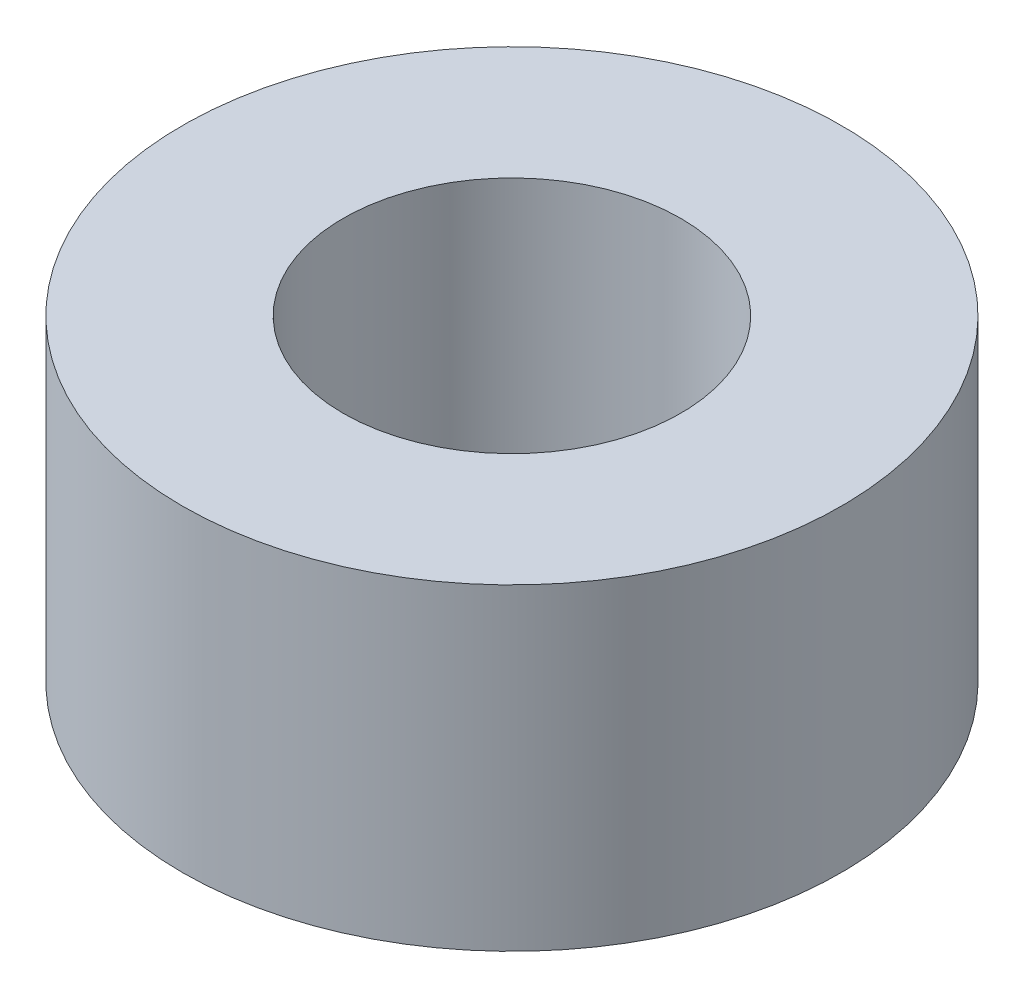
ISO-10303-21;
HEADER;
FILE_DESCRIPTION(('STEP AP214'),'2;1');
FILE_NAME('part.step','',(''),(''),'','','');
FILE_SCHEMA(('AUTOMOTIVE_DESIGN { 1 0 10303 214 1 1 1 1 }'));
ENDSEC;
DATA;
#1=APPLICATION_CONTEXT('core data for automotive mechanical design processes');
#2=APPLICATION_PROTOCOL_DEFINITION('international standard','automotive_design',2000,#1);
#3=PRODUCT_CONTEXT('',#1,'mechanical');
#4=PRODUCT('Part','Part','',(#3));
#5=PRODUCT_RELATED_PRODUCT_CATEGORY('part','',(#4));
#6=PRODUCT_DEFINITION_FORMATION('','',#4);
#7=PRODUCT_DEFINITION_CONTEXT('part definition',#1,'design');
#8=PRODUCT_DEFINITION('design','',#6,#7);
#9=PRODUCT_DEFINITION_SHAPE('','',#8);
#10=(LENGTH_UNIT() NAMED_UNIT(*) SI_UNIT(.MILLI.,.METRE.));
#11=(NAMED_UNIT(*) PLANE_ANGLE_UNIT() SI_UNIT($,.RADIAN.));
#12=(NAMED_UNIT(*) SI_UNIT($,.STERADIAN.) SOLID_ANGLE_UNIT());
#13=UNCERTAINTY_MEASURE_WITH_UNIT(LENGTH_MEASURE(1.E-05),#10,'distance_accuracy_value','');
#14=(GEOMETRIC_REPRESENTATION_CONTEXT(3) GLOBAL_UNCERTAINTY_ASSIGNED_CONTEXT((#13)) GLOBAL_UNIT_ASSIGNED_CONTEXT((#10,
#11,#12)) REPRESENTATION_CONTEXT('',''));
#15=CARTESIAN_POINT('',(0.,0.,0.));
#16=DIRECTION('',(0.,0.,1.));
#17=DIRECTION('',(1.,0.,0.));
#18=AXIS2_PLACEMENT_3D('',#15,#16,#17);
#19=CARTESIAN_POINT('',(0.,3.9,0.));
#20=DIRECTION('',(0.,-1.,0.));
#21=DIRECTION('',(0.,0.,-1.));
#22=AXIS2_PLACEMENT_3D('',#19,#20,#21);
#23=CYLINDRICAL_SURFACE('',#22,4.05);
#24=CARTESIAN_POINT('',(0.,3.9,0.));
#25=DIRECTION('',(0.,1.,0.));
#26=DIRECTION('',(0.,0.,1.));
#27=AXIS2_PLACEMENT_3D('',#24,#25,#26);
#28=CIRCLE('',#27,4.05);
#29=CARTESIAN_POINT('',(0.,3.9,4.05));
#30=VERTEX_POINT('',#29);
#31=EDGE_CURVE('E10',#30,#30,#28,.T.);
#32=ORIENTED_EDGE('',*,*,#31,.F.);
#33=EDGE_LOOP('',(#32));
#34=FACE_BOUND('',#33,.T.);
#35=CARTESIAN_POINT('',(0.,0.,0.));
#36=DIRECTION('',(0.,1.,0.));
#37=DIRECTION('',(0.,0.,1.));
#38=AXIS2_PLACEMENT_3D('',#35,#36,#37);
#39=CIRCLE('',#38,4.05);
#40=CARTESIAN_POINT('',(0.,0.,4.05));
#41=VERTEX_POINT('',#40);
#42=EDGE_CURVE('E36',#41,#41,#39,.T.);
#43=ORIENTED_EDGE('',*,*,#42,.T.);
#44=EDGE_LOOP('',(#43));
#45=FACE_BOUND('',#44,.T.);
#46=ADVANCED_FACE('F33',(#34,#45),#23,.T.);
#47=CARTESIAN_POINT('',(0.,3.9,0.));
#48=DIRECTION('',(0.,1.,0.));
#49=DIRECTION('',(0.,0.,1.));
#50=AXIS2_PLACEMENT_3D('',#47,#48,#49);
#51=PLANE('',#50);
#52=CARTESIAN_POINT('',(0.,3.9,0.));
#53=DIRECTION('',(0.,-1.,0.));
#54=DIRECTION('',(0.,0.,-1.));
#55=AXIS2_PLACEMENT_3D('',#52,#53,#54);
#56=CIRCLE('',#55,2.075);
#57=CARTESIAN_POINT('',(0.,3.9,-2.075));
#58=VERTEX_POINT('',#57);
#59=EDGE_CURVE('E43',#58,#58,#56,.T.);
#60=ORIENTED_EDGE('',*,*,#59,.T.);
#61=EDGE_LOOP('',(#60));
#62=FACE_BOUND('',#61,.T.);
#63=ORIENTED_EDGE('',*,*,#31,.T.);
#64=EDGE_LOOP('',(#63));
#65=FACE_BOUND('',#64,.T.);
#66=ADVANCED_FACE('F51',(#62,#65),#51,.T.);
#67=CARTESIAN_POINT('',(0.,0.,0.));
#68=DIRECTION('',(0.,1.,0.));
#69=DIRECTION('',(0.,0.,1.));
#70=AXIS2_PLACEMENT_3D('',#67,#68,#69);
#71=PLANE('',#70);
#72=CARTESIAN_POINT('',(0.,0.,0.));
#73=DIRECTION('',(0.,-1.,0.));
#74=DIRECTION('',(0.,0.,-1.));
#75=AXIS2_PLACEMENT_3D('',#72,#73,#74);
#76=CIRCLE('',#75,2.075);
#77=CARTESIAN_POINT('',(0.,0.,-2.075));
#78=VERTEX_POINT('',#77);
#79=EDGE_CURVE('E45',#78,#78,#76,.T.);
#80=ORIENTED_EDGE('',*,*,#79,.F.);
#81=EDGE_LOOP('',(#80));
#82=FACE_BOUND('',#81,.T.);
#83=ORIENTED_EDGE('',*,*,#42,.F.);
#84=EDGE_LOOP('',(#83));
#85=FACE_BOUND('',#84,.T.);
#86=ADVANCED_FACE('F56',(#82,#85),#71,.F.);
#87=CARTESIAN_POINT('',(0.,3.9,0.));
#88=DIRECTION('',(0.,-1.,0.));
#89=DIRECTION('',(0.,0.,-1.));
#90=AXIS2_PLACEMENT_3D('',#87,#88,#89);
#91=CYLINDRICAL_SURFACE('',#90,2.075);
#92=ORIENTED_EDGE('',*,*,#59,.F.);
#93=EDGE_LOOP('',(#92));
#94=FACE_BOUND('',#93,.T.);
#95=ORIENTED_EDGE('',*,*,#79,.T.);
#96=EDGE_LOOP('',(#95));
#97=FACE_BOUND('',#96,.T.);
#98=ADVANCED_FACE('F53',(#94,#97),#91,.F.);
#99=CLOSED_SHELL('',(#46,#66,#86,#98));
#100=MANIFOLD_SOLID_BREP('B2',#99);
#101=ADVANCED_BREP_SHAPE_REPRESENTATION('',(#18,#100),#14);
#102=SHAPE_DEFINITION_REPRESENTATION(#9,#101);
ENDSEC;
END-ISO-10303-21;
